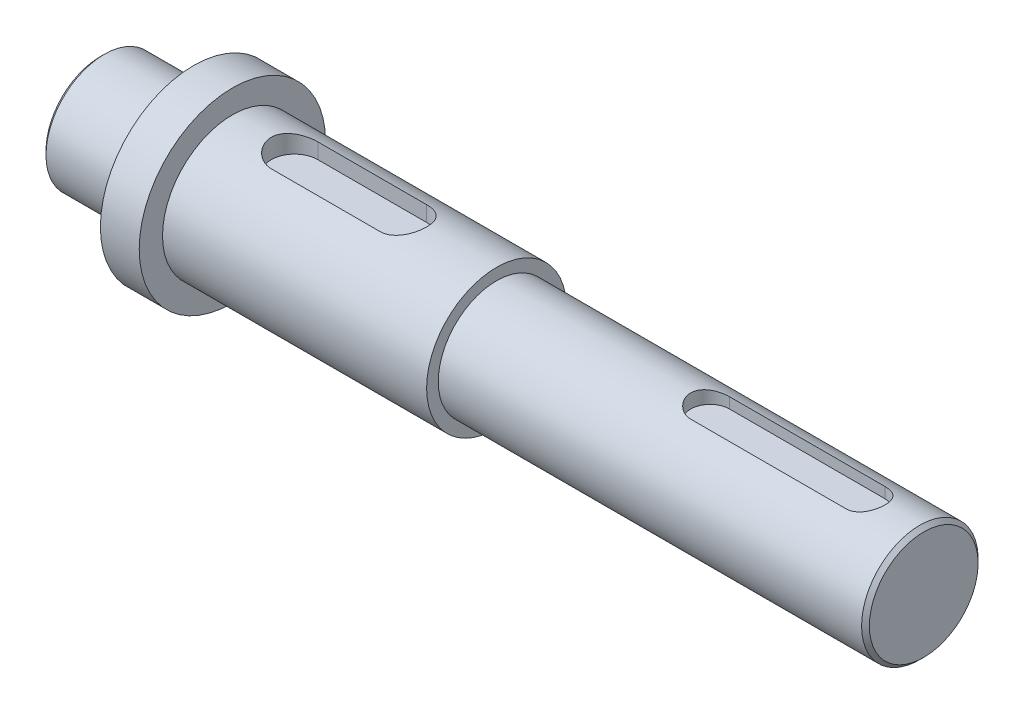
ISO-10303-21;
HEADER;
FILE_DESCRIPTION(('STEP AP214'),'2;1');
FILE_NAME('part.step','',(''),(''),'','','');
FILE_SCHEMA(('AUTOMOTIVE_DESIGN { 1 0 10303 214 1 1 1 1 }'));
ENDSEC;
DATA;
#1=APPLICATION_CONTEXT('core data for automotive mechanical design processes');
#2=APPLICATION_PROTOCOL_DEFINITION('international standard','automotive_design',2000,#1);
#3=PRODUCT_CONTEXT('',#1,'mechanical');
#4=PRODUCT('Part','Part','',(#3));
#5=PRODUCT_RELATED_PRODUCT_CATEGORY('part','',(#4));
#6=PRODUCT_DEFINITION_FORMATION('','',#4);
#7=PRODUCT_DEFINITION_CONTEXT('part definition',#1,'design');
#8=PRODUCT_DEFINITION('design','',#6,#7);
#9=PRODUCT_DEFINITION_SHAPE('','',#8);
#10=(LENGTH_UNIT() NAMED_UNIT(*) SI_UNIT(.MILLI.,.METRE.));
#11=(NAMED_UNIT(*) PLANE_ANGLE_UNIT() SI_UNIT($,.RADIAN.));
#12=(NAMED_UNIT(*) SI_UNIT($,.STERADIAN.) SOLID_ANGLE_UNIT());
#13=UNCERTAINTY_MEASURE_WITH_UNIT(LENGTH_MEASURE(1.E-05),#10,'distance_accuracy_value','');
#14=(GEOMETRIC_REPRESENTATION_CONTEXT(3) GLOBAL_UNCERTAINTY_ASSIGNED_CONTEXT((#13)) GLOBAL_UNIT_ASSIGNED_CONTEXT((#10,
#11,#12)) REPRESENTATION_CONTEXT('',''));
#15=CARTESIAN_POINT('',(0.,0.,0.));
#16=DIRECTION('',(0.,0.,1.));
#17=DIRECTION('',(1.,0.,0.));
#18=AXIS2_PLACEMENT_3D('',#15,#16,#17);
#19=CARTESIAN_POINT('',(-69.1916508538899,0.,0.));
#20=DIRECTION('',(1.,0.,0.));
#21=DIRECTION('',(0.,0.,-1.));
#22=AXIS2_PLACEMENT_3D('',#19,#20,#21);
#23=PLANE('',#22);
#24=CARTESIAN_POINT('',(-69.1916508538899,0.,0.));
#25=DIRECTION('',(1.,0.,0.));
#26=DIRECTION('',(0.,0.,-1.));
#27=AXIS2_PLACEMENT_3D('',#24,#25,#26);
#28=CIRCLE('',#27,7.00000000000001);
#29=CARTESIAN_POINT('',(-69.1916508538899,0.,-7.00000000000001));
#30=VERTEX_POINT('',#29);
#31=EDGE_CURVE('E51',#30,#30,#28,.F.);
#32=ORIENTED_EDGE('',*,*,#31,.T.);
#33=EDGE_LOOP('',(#32));
#34=FACE_BOUND('',#33,.T.);
#35=ADVANCED_FACE('F41',(#34),#23,.F.);
#36=CARTESIAN_POINT('',(-89.707779886148,0.,0.));
#37=DIRECTION('',(-1.,0.,0.));
#38=DIRECTION('',(0.,0.,1.));
#39=AXIS2_PLACEMENT_3D('',#36,#37,#38);
#40=CYLINDRICAL_SURFACE('',#39,7.5);
#41=CARTESIAN_POINT('',(-68.6916508538899,0.,0.));
#42=DIRECTION('',(1.,0.,0.));
#43=DIRECTION('',(0.,0.,-1.));
#44=AXIS2_PLACEMENT_3D('',#41,#42,#43);
#45=CIRCLE('',#44,7.5);
#46=CARTESIAN_POINT('',(-68.6916508538899,0.,-7.5));
#47=VERTEX_POINT('',#46);
#48=EDGE_CURVE('E11',#47,#47,#45,.T.);
#49=ORIENTED_EDGE('',*,*,#48,.T.);
#50=EDGE_LOOP('',(#49));
#51=FACE_BOUND('',#50,.T.);
#52=CARTESIAN_POINT('',(-57.1916508538899,0.,0.));
#53=DIRECTION('',(-1.,0.,0.));
#54=DIRECTION('',(0.,0.,1.));
#55=AXIS2_PLACEMENT_3D('',#52,#53,#54);
#56=CIRCLE('',#55,7.5);
#57=CARTESIAN_POINT('',(-57.1916508538899,0.,7.5));
#58=VERTEX_POINT('',#57);
#59=EDGE_CURVE('E198',#58,#58,#56,.T.);
#60=ORIENTED_EDGE('',*,*,#59,.T.);
#61=EDGE_LOOP('',(#60));
#62=FACE_BOUND('',#61,.T.);
#63=ADVANCED_FACE('F275',(#51,#62),#40,.T.);
#64=CARTESIAN_POINT('',(-57.1916508538899,7.5,0.));
#65=DIRECTION('',(1.,0.,0.));
#66=DIRECTION('',(0.,0.,-1.));
#67=AXIS2_PLACEMENT_3D('',#64,#65,#66);
#68=PLANE('',#67);
#69=ORIENTED_EDGE('',*,*,#59,.F.);
#70=EDGE_LOOP('',(#69));
#71=FACE_BOUND('',#70,.T.);
#72=CARTESIAN_POINT('',(-57.1916508538899,0.,0.));
#73=DIRECTION('',(-1.,0.,0.));
#74=DIRECTION('',(0.,0.,1.));
#75=AXIS2_PLACEMENT_3D('',#72,#73,#74);
#76=CIRCLE('',#75,12.);
#77=CARTESIAN_POINT('',(-57.1916508538899,0.,12.));
#78=VERTEX_POINT('',#77);
#79=EDGE_CURVE('E194',#78,#78,#76,.T.);
#80=ORIENTED_EDGE('',*,*,#79,.T.);
#81=EDGE_LOOP('',(#80));
#82=FACE_BOUND('',#81,.T.);
#83=ADVANCED_FACE('F281',(#71,#82),#68,.F.);
#84=CARTESIAN_POINT('',(-89.707779886148,0.,0.));
#85=DIRECTION('',(-1.,0.,0.));
#86=DIRECTION('',(0.,0.,1.));
#87=AXIS2_PLACEMENT_3D('',#84,#85,#86);
#88=CYLINDRICAL_SURFACE('',#87,12.);
#89=ORIENTED_EDGE('',*,*,#79,.F.);
#90=EDGE_LOOP('',(#89));
#91=FACE_BOUND('',#90,.T.);
#92=CARTESIAN_POINT('',(-52.1916508538899,0.,0.));
#93=DIRECTION('',(-1.,0.,0.));
#94=DIRECTION('',(0.,0.,1.));
#95=AXIS2_PLACEMENT_3D('',#92,#93,#94);
#96=CIRCLE('',#95,12.);
#97=CARTESIAN_POINT('',(-52.1916508538899,0.,12.));
#98=VERTEX_POINT('',#97);
#99=EDGE_CURVE('E190',#98,#98,#96,.T.);
#100=ORIENTED_EDGE('',*,*,#99,.T.);
#101=EDGE_LOOP('',(#100));
#102=FACE_BOUND('',#101,.T.);
#103=ADVANCED_FACE('F456',(#91,#102),#88,.T.);
#104=CARTESIAN_POINT('',(-52.1916508538899,12.,0.));
#105=DIRECTION('',(-1.,0.,0.));
#106=DIRECTION('',(0.,0.,1.));
#107=AXIS2_PLACEMENT_3D('',#104,#105,#106);
#108=PLANE('',#107);
#109=ORIENTED_EDGE('',*,*,#99,.F.);
#110=EDGE_LOOP('',(#109));
#111=FACE_BOUND('',#110,.T.);
#112=CARTESIAN_POINT('',(-52.1916508538899,0.,0.));
#113=DIRECTION('',(-1.,0.,0.));
#114=DIRECTION('',(0.,0.,1.));
#115=AXIS2_PLACEMENT_3D('',#112,#113,#114);
#116=CIRCLE('',#115,9.);
#117=CARTESIAN_POINT('',(-52.1916508538899,0.,9.));
#118=VERTEX_POINT('',#117);
#119=EDGE_CURVE('E186',#118,#118,#116,.T.);
#120=ORIENTED_EDGE('',*,*,#119,.T.);
#121=EDGE_LOOP('',(#120));
#122=FACE_BOUND('',#121,.T.);
#123=ADVANCED_FACE('F439',(#111,#122),#108,.F.);
#124=CARTESIAN_POINT('',(-89.707779886148,0.,0.));
#125=DIRECTION('',(-1.,0.,0.));
#126=DIRECTION('',(0.,0.,1.));
#127=AXIS2_PLACEMENT_3D('',#124,#125,#126);
#128=CYLINDRICAL_SURFACE('',#127,9.);
#129=DIRECTION('',(-1.,0.,0.));
#130=VECTOR('',#129,1.);
#131=CARTESIAN_POINT('',(-89.707779886148,8.48528137423857,-3.));
#132=LINE('',#131,#130);
#133=CARTESIAN_POINT('',(-44.1916508538899,8.48528137423857,-3.));
#134=VERTEX_POINT('',#133);
#135=CARTESIAN_POINT('',(-30.1916508538899,8.48528137423857,-3.));
#136=VERTEX_POINT('',#135);
#137=EDGE_CURVE('E427',#134,#136,#132,.F.);
#138=ORIENTED_EDGE('',*,*,#137,.T.);
#139=CARTESIAN_POINT('',(-30.1916508538899,8.48528137423857,-3.));
#140=CARTESIAN_POINT('',(-30.1098023605056,8.48526831927789,-3.00001078932487));
#141=CARTESIAN_POINT('',(-30.0279611642795,8.48646532685483,-2.99665064665902));
#142=CARTESIAN_POINT('',(-29.8649136078708,8.49118228945209,-2.98327254936565));
#143=CARTESIAN_POINT('',(-29.7837070823043,8.49470161740771,-2.97325639196642));
#144=CARTESIAN_POINT('',(-29.6227422678645,8.50395246303008,-2.94668951307354));
#145=CARTESIAN_POINT('',(-29.5429804108289,8.50967741820142,-2.93015817315762));
#146=CARTESIAN_POINT('',(-29.3852409315905,8.52315143887203,-2.89073017236145));
#147=CARTESIAN_POINT('',(-29.3072633739819,8.53090057752397,-2.86783328143241));
#148=CARTESIAN_POINT('',(-29.0768969582327,8.55683928952694,-2.7898986156743));
#149=CARTESIAN_POINT('',(-28.9278358649273,8.57773492660859,-2.72557700172276));
#150=CARTESIAN_POINT('',(-28.6425986801326,8.62436440905027,-2.5742134092753));
#151=CARTESIAN_POINT('',(-28.5064305709487,8.65010122261302,-2.4871574792233));
#152=CARTESIAN_POINT('',(-28.2454993697301,8.70463418867365,-2.28915595016086));
#153=CARTESIAN_POINT('',(-28.1213086825877,8.73350627313643,-2.17747541556634));
#154=CARTESIAN_POINT('',(-27.8930303299899,8.79041552071283,-1.93496485428979));
#155=CARTESIAN_POINT('',(-27.7889462442339,8.81845253440363,-1.80413142497752));
#156=CARTESIAN_POINT('',(-27.6012129848502,8.87141647315468,-1.52281106991368));
#157=CARTESIAN_POINT('',(-27.5181680848832,8.8962431223892,-1.37190030336069));
#158=CARTESIAN_POINT('',(-27.3788739146845,8.9390882626048,-1.05728771462316));
#159=CARTESIAN_POINT('',(-27.3226164589191,8.95710883299482,-0.893589817668321));
#160=CARTESIAN_POINT('',(-27.2404437234032,8.98377213313373,-0.564088045229086));
#161=CARTESIAN_POINT('',(-27.2135410524982,8.99271926928151,-0.398555505085339));
#162=CARTESIAN_POINT('',(-27.1877019420477,9.0013082524901,-0.0650969066624202));
#163=CARTESIAN_POINT('',(-27.1887588387912,9.00095231678788,0.102828571762972));
#164=CARTESIAN_POINT('',(-27.2181837198212,8.99118115872284,0.429311537733987));
#165=CARTESIAN_POINT('',(-27.245478817896,8.98212182877037,0.587978116884621));
#166=CARTESIAN_POINT('',(-27.3248303997818,8.9564088159923,0.898332184121461));
#167=CARTESIAN_POINT('',(-27.3768882565945,8.93975471206725,1.05001928471038));
#168=CARTESIAN_POINT('',(-27.5049151490252,8.90027004455731,1.34445790368094));
#169=CARTESIAN_POINT('',(-27.5811896880341,8.8773611217211,1.48706564697704));
#170=CARTESIAN_POINT('',(-27.7552300090946,8.82775164383326,1.75777363724201));
#171=CARTESIAN_POINT('',(-27.853001637214,8.80105005807909,1.88586992347828));
#172=CARTESIAN_POINT('',(-28.0726667363483,8.74518810577395,2.13029252762403));
#173=CARTESIAN_POINT('',(-28.1954779052143,8.71597116015319,2.24578277403273));
#174=CARTESIAN_POINT('',(-28.4589648991824,8.65942491449435,2.45481413464109));
#175=CARTESIAN_POINT('',(-28.5996464731824,8.63209622629495,2.5483481578384));
#176=CARTESIAN_POINT('',(-28.8977309321264,8.58210018141277,2.71201733554396));
#177=CARTESIAN_POINT('',(-29.0553500050085,8.55950759277136,2.78178668333576));
#178=CARTESIAN_POINT('',(-29.2993349884447,8.5316849132946,2.86551808116445));
#179=CARTESIAN_POINT('',(-29.3819076109602,8.52342263559069,2.889939000529));
#180=CARTESIAN_POINT('',(-29.5490212501003,8.50917513666655,2.93162549079289));
#181=CARTESIAN_POINT('',(-29.633561349226,8.50318887578236,2.94889432902107));
#182=CARTESIAN_POINT('',(-29.7968841316406,8.49410161473166,2.97496555991272));
#183=CARTESIAN_POINT('',(-29.875563714526,8.49080270505212,2.98435073218189));
#184=CARTESIAN_POINT('',(-30.0333763833948,8.48638843638536,2.99686829404165));
#185=CARTESIAN_POINT('',(-30.1125087515318,8.48527025982562,3.00000875209309));
#186=CARTESIAN_POINT('',(-30.1916508538899,8.48528137423857,3.));
#187=B_SPLINE_CURVE_WITH_KNOTS('',3,(#139,#140,#141,#142,#143,#144,#145,#146,#147,#148,#149,
#150,#151,#152,#153,#154,#155,#156,#157,#158,#159,#160,#161,#162,#163,#164,#165,#166,#167,#168,
#169,#170,#171,#172,#173,#174,#175,#176,#177,#178,#179,#180,#181,#182,#183,#184,#185,#186),
.UNSPECIFIED.,.F.,.F.,(4,2,2,2,2,2,2,2,2,2,2,2,2,2,2,2,2,2,2,2,2,2,2,4),(0.,0.245455454206297,
0.490844658508385,0.735509315314893,0.980182815366468,1.46881220307906,1.95774215958628,
2.46393436906068,2.97021661609277,3.48971320817338,4.00905095381417,4.51032334200243,
5.01147626109962,5.4929717741524,5.97449398742778,6.46234978495938,6.9503384178434,
7.46126084192185,7.97234804765762,8.49098011802155,8.75020549988895,9.00931232726958,
9.24695816264695,9.4842967485361),.UNSPECIFIED.);
#188=CARTESIAN_POINT('',(-30.1916508538899,8.48528137423857,3.));
#189=VERTEX_POINT('',#188);
#190=EDGE_CURVE('E202',#136,#189,#187,.T.);
#191=ORIENTED_EDGE('',*,*,#190,.T.);
#192=DIRECTION('',(-1.,0.,0.));
#193=VECTOR('',#192,1.);
#194=CARTESIAN_POINT('',(-89.707779886148,8.48528137423857,3.));
#195=LINE('',#194,#193);
#196=CARTESIAN_POINT('',(-44.1916508538899,8.48528137423857,3.));
#197=VERTEX_POINT('',#196);
#198=EDGE_CURVE('E434',#189,#197,#195,.T.);
#199=ORIENTED_EDGE('',*,*,#198,.T.);
#200=CARTESIAN_POINT('',(-44.1916508538899,8.48528137423857,3.));
#201=CARTESIAN_POINT('',(-44.2734993472743,8.48526831927789,3.00001078932487));
#202=CARTESIAN_POINT('',(-44.3553405435004,8.48646532685483,2.99665064665902));
#203=CARTESIAN_POINT('',(-44.5183880999091,8.49118228945209,2.98327254936565));
#204=CARTESIAN_POINT('',(-44.5995946254756,8.49470161740771,2.97325639196642));
#205=CARTESIAN_POINT('',(-44.7605594399154,8.50395246303008,2.94668951307354));
#206=CARTESIAN_POINT('',(-44.840321296951,8.50967741820142,2.93015817315762));
#207=CARTESIAN_POINT('',(-44.9980607761893,8.52315143887203,2.89073017236145));
#208=CARTESIAN_POINT('',(-45.0760383337979,8.53090057752397,2.86783328143241));
#209=CARTESIAN_POINT('',(-45.3064047495472,8.55683928952693,2.7898986156743));
#210=CARTESIAN_POINT('',(-45.4554658428526,8.57773492660859,2.72557700172276));
#211=CARTESIAN_POINT('',(-45.7407030276473,8.62436440905027,2.5742134092753));
#212=CARTESIAN_POINT('',(-45.8768711368311,8.65010122261301,2.4871574792233));
#213=CARTESIAN_POINT('',(-46.1378023380497,8.70463418867364,2.28915595016086));
#214=CARTESIAN_POINT('',(-46.2619930251922,8.73350627313643,2.17747541556635));
#215=CARTESIAN_POINT('',(-46.49027137779,8.79041552071283,1.93496485428979));
#216=CARTESIAN_POINT('',(-46.594355463546,8.81845253440363,1.80413142497752));
#217=CARTESIAN_POINT('',(-46.7820887229297,8.87141647315469,1.52281106991367));
#218=CARTESIAN_POINT('',(-46.8651336228967,8.8962431223892,1.37190030336069));
#219=CARTESIAN_POINT('',(-47.0044277930954,8.9390882626048,1.05728771462316));
#220=CARTESIAN_POINT('',(-47.0606852488608,8.95710883299482,0.89358981766832));
#221=CARTESIAN_POINT('',(-47.1428579843767,8.98377213313373,0.564088045229086));
#222=CARTESIAN_POINT('',(-47.1697606552816,8.99271926928151,0.398555505085339));
#223=CARTESIAN_POINT('',(-47.1955997657322,9.0013082524901,0.0650969066624194));
#224=CARTESIAN_POINT('',(-47.1945428689887,9.00095231678789,-0.102828571762973));
#225=CARTESIAN_POINT('',(-47.1651179879587,8.99118115872284,-0.429311537733988));
#226=CARTESIAN_POINT('',(-47.1378228898839,8.98212182877037,-0.58797811688462));
#227=CARTESIAN_POINT('',(-47.058471307998,8.9564088159923,-0.898332184121461));
#228=CARTESIAN_POINT('',(-47.0064134511854,8.93975471206725,-1.05001928471038));
#229=CARTESIAN_POINT('',(-46.8783865587547,8.90027004455731,-1.34445790368094));
#230=CARTESIAN_POINT('',(-46.8021120197458,8.87736112172109,-1.48706564697704));
#231=CARTESIAN_POINT('',(-46.6280716986852,8.82775164383326,-1.75777363724201));
#232=CARTESIAN_POINT('',(-46.5303000705659,8.80105005807909,-1.88586992347829));
#233=CARTESIAN_POINT('',(-46.3106349714316,8.74518810577395,-2.13029252762403));
#234=CARTESIAN_POINT('',(-46.1878238025656,8.71597116015319,-2.24578277403273));
#235=CARTESIAN_POINT('',(-45.9243368085975,8.65942491449435,-2.45481413464109));
#236=CARTESIAN_POINT('',(-45.7836552345975,8.63209622629495,-2.54834815783839));
#237=CARTESIAN_POINT('',(-45.4855707756535,8.58210018141277,-2.71201733554396));
#238=CARTESIAN_POINT('',(-45.3279517027713,8.55950759277136,-2.78178668333576));
#239=CARTESIAN_POINT('',(-45.0839667193352,8.5316849132946,-2.86551808116445));
#240=CARTESIAN_POINT('',(-45.0013940968197,8.52342263559069,-2.889939000529));
#241=CARTESIAN_POINT('',(-44.8342804576796,8.50917513666655,-2.93162549079289));
#242=CARTESIAN_POINT('',(-44.7497403585539,8.50318887578236,-2.94889432902107));
#243=CARTESIAN_POINT('',(-44.5864175761393,8.49410161473166,-2.97496555991272));
#244=CARTESIAN_POINT('',(-44.5077379932539,8.49080270505212,-2.98435073218189));
#245=CARTESIAN_POINT('',(-44.3499253243851,8.48638843638536,-2.99686829404165));
#246=CARTESIAN_POINT('',(-44.2707929562481,8.48527025982562,-3.00000875209309));
#247=CARTESIAN_POINT('',(-44.19165085389,8.48528137423857,-3.));
#248=B_SPLINE_CURVE_WITH_KNOTS('',3,(#200,#201,#202,#203,#204,#205,#206,#207,#208,#209,#210,
#211,#212,#213,#214,#215,#216,#217,#218,#219,#220,#221,#222,#223,#224,#225,#226,#227,#228,#229,
#230,#231,#232,#233,#234,#235,#236,#237,#238,#239,#240,#241,#242,#243,#244,#245,#246,#247),
.UNSPECIFIED.,.F.,.F.,(4,2,2,2,2,2,2,2,2,2,2,2,2,2,2,2,2,2,2,2,2,2,2,4),(0.,0.245455454206294,
0.490844658508392,0.735509315314893,0.980182815366468,1.46881220307906,1.95774215958628,
2.46393436906068,2.97021661609277,3.48971320817339,4.00905095381416,4.51032334200243,
5.01147626109962,5.4929717741524,5.97449398742778,6.46234978495938,6.9503384178434,
7.46126084192185,7.97234804765761,8.49098011802155,8.75020549988896,9.00931232726959,
9.24695816264695,9.48429674853609),.UNSPECIFIED.);
#249=EDGE_CURVE('E66',#197,#134,#248,.T.);
#250=ORIENTED_EDGE('',*,*,#249,.T.);
#251=EDGE_LOOP('',(#138,#191,#199,#250));
#252=FACE_BOUND('',#251,.T.);
#253=ORIENTED_EDGE('',*,*,#119,.F.);
#254=EDGE_LOOP('',(#253));
#255=FACE_BOUND('',#254,.T.);
#256=CARTESIAN_POINT('',(-18.1916508538899,0.,0.));
#257=DIRECTION('',(-1.,0.,0.));
#258=DIRECTION('',(0.,0.,1.));
#259=AXIS2_PLACEMENT_3D('',#256,#257,#258);
#260=CIRCLE('',#259,9.);
#261=CARTESIAN_POINT('',(-18.1916508538899,0.,9.));
#262=VERTEX_POINT('',#261);
#263=EDGE_CURVE('E182',#262,#262,#260,.T.);
#264=ORIENTED_EDGE('',*,*,#263,.T.);
#265=EDGE_LOOP('',(#264));
#266=FACE_BOUND('',#265,.T.);
#267=ADVANCED_FACE('F218',(#252,#255,#266),#128,.T.);
#268=CARTESIAN_POINT('',(-18.1916508538899,9.,0.));
#269=DIRECTION('',(-1.,0.,0.));
#270=DIRECTION('',(0.,0.,1.));
#271=AXIS2_PLACEMENT_3D('',#268,#269,#270);
#272=PLANE('',#271);
#273=ORIENTED_EDGE('',*,*,#263,.F.);
#274=EDGE_LOOP('',(#273));
#275=FACE_BOUND('',#274,.T.);
#276=CARTESIAN_POINT('',(-18.1916508538899,0.,0.));
#277=DIRECTION('',(-1.,0.,0.));
#278=DIRECTION('',(0.,0.,1.));
#279=AXIS2_PLACEMENT_3D('',#276,#277,#278);
#280=CIRCLE('',#279,7.5);
#281=CARTESIAN_POINT('',(-18.1916508538899,0.,7.5));
#282=VERTEX_POINT('',#281);
#283=EDGE_CURVE('E168',#282,#282,#280,.T.);
#284=ORIENTED_EDGE('',*,*,#283,.T.);
#285=EDGE_LOOP('',(#284));
#286=FACE_BOUND('',#285,.T.);
#287=ADVANCED_FACE('F245',(#275,#286),#272,.F.);
#288=CARTESIAN_POINT('',(-89.707779886148,0.,0.));
#289=DIRECTION('',(-1.,0.,0.));
#290=DIRECTION('',(0.,0.,1.));
#291=AXIS2_PLACEMENT_3D('',#288,#289,#290);
#292=CYLINDRICAL_SURFACE('',#291,7.5);
#293=CARTESIAN_POINT('',(36.3083491461101,0.,0.));
#294=DIRECTION('',(-1.,0.,0.));
#295=DIRECTION('',(0.,0.,1.));
#296=AXIS2_PLACEMENT_3D('',#293,#294,#295);
#297=CIRCLE('',#296,7.5);
#298=CARTESIAN_POINT('',(36.3083491461101,0.,7.5));
#299=VERTEX_POINT('',#298);
#300=EDGE_CURVE('E304',#299,#299,#297,.T.);
#301=ORIENTED_EDGE('',*,*,#300,.T.);
#302=EDGE_LOOP('',(#301));
#303=FACE_BOUND('',#302,.T.);
#304=DIRECTION('',(-1.,0.,0.));
#305=VECTOR('',#304,1.);
#306=CARTESIAN_POINT('',(-89.707779886148,7.07106781186548,-2.5));
#307=LINE('',#306,#305);
#308=CARTESIAN_POINT('',(9.30834914611006,7.07106781186548,-2.5));
#309=VERTEX_POINT('',#308);
#310=CARTESIAN_POINT('',(29.3083491461101,7.07106781186548,-2.5));
#311=VERTEX_POINT('',#310);
#312=EDGE_CURVE('E306',#309,#311,#307,.F.);
#313=ORIENTED_EDGE('',*,*,#312,.T.);
#314=CARTESIAN_POINT('',(29.3083491461101,7.07106781186548,-2.5));
#315=CARTESIAN_POINT('',(29.3765562239304,7.07105693273157,-2.50000899110406));
#316=CARTESIAN_POINT('',(29.4447572207855,7.07205443904569,-2.49720887221585));
#317=CARTESIAN_POINT('',(29.5806301844593,7.07598524121007,-2.4860604578047));
#318=CARTESIAN_POINT('',(29.6483022890981,7.07891801450643,-2.47771365997202));
#319=CARTESIAN_POINT('',(29.7824396344646,7.08662705252507,-2.45557459422795));
#320=CARTESIAN_POINT('',(29.8489078486609,7.09139784850118,-2.44179847763135));
#321=CARTESIAN_POINT('',(29.9803574146929,7.10262619906002,-2.4089418103012));
#322=CARTESIAN_POINT('',(30.0453387127,7.10908381460331,-2.38986106786032));
#323=CARTESIAN_POINT('',(30.2373107258247,7.13069940793912,-2.32491551306196));
#324=CARTESIAN_POINT('',(30.36152830358,7.14811243884051,-2.2713141681025));
#325=CARTESIAN_POINT('',(30.5992259575734,7.1869703408752,-2.14517784106255));
#326=CARTESIAN_POINT('',(30.7126993818902,7.20841768551077,-2.07263123268532));
#327=CARTESIAN_POINT('',(30.9301420495809,7.25386182389479,-1.90762995846819));
#328=CARTESIAN_POINT('',(31.0336342888783,7.27792189428067,-1.81456284630833));
#329=CARTESIAN_POINT('',(31.2238662493438,7.32534626726038,-1.61247071190512));
#330=CARTESIAN_POINT('',(31.3106029874291,7.34871044533518,-1.50344285413658));
#331=CARTESIAN_POINT('',(31.4670473703725,7.39284706096344,-1.26900922493972));
#332=CARTESIAN_POINT('',(31.5362514538523,7.41353593532888,-1.1432502528446));
#333=CARTESIAN_POINT('',(31.6523299285448,7.44924021883279,-0.881073095475285));
#334=CARTESIAN_POINT('',(31.6992111410358,7.46425736081204,-0.74465818122588));
#335=CARTESIAN_POINT('',(31.7676884223683,7.48647677762783,-0.470073371182905));
#336=CARTESIAN_POINT('',(31.7901073170673,7.49393272446142,-0.33212958815374));
#337=CARTESIAN_POINT('',(31.8116399028486,7.50109021034827,-0.0542474216361978));
#338=CARTESIAN_POINT('',(31.8107591470258,7.50079359709905,0.0856904786402175));
#339=CARTESIAN_POINT('',(31.7862384357096,7.49265096581776,0.357759612692404));
#340=CARTESIAN_POINT('',(31.7634925505053,7.48510152476447,0.489981756428174));
#341=CARTESIAN_POINT('',(31.6973661501309,7.46367401253772,0.748610161077312));
#342=CARTESIAN_POINT('',(31.6539844907848,7.44979559044789,0.875016099077737));
#343=CARTESIAN_POINT('',(31.5472957219156,7.41689170677793,1.12038155754035));
#344=CARTESIAN_POINT('',(31.4837340332524,7.39780094595656,1.23922126412503));
#345=CARTESIAN_POINT('',(31.3386992676851,7.35645969200236,1.46481147275367));
#346=CARTESIAN_POINT('',(31.2572213185079,7.33420833994017,1.57155867428943));
#347=CARTESIAN_POINT('',(31.0741715211031,7.28765679856813,1.77524334927518));
#348=CARTESIAN_POINT('',(30.9718352870818,7.26330946699776,1.87148402903098));
#349=CARTESIAN_POINT('',(30.7522454218236,7.21618726182138,2.04568006205172));
#350=CARTESIAN_POINT('',(30.634986990103,7.19341289789386,2.12362950795974));
#351=CARTESIAN_POINT('',(30.3866487002258,7.15175078440791,2.26000831398175));
#352=CARTESIAN_POINT('',(30.2553903587774,7.13292537370586,2.31813252376915));
#353=CARTESIAN_POINT('',(29.9842317021355,7.10202742655098,2.41115057675285));
#354=CARTESIAN_POINT('',(29.8443454126797,7.08994423522482,2.4460810901384));
#355=CARTESIAN_POINT('',(29.6373025542401,7.078413552368,2.47914539070207));
#356=CARTESIAN_POINT('',(29.5717456714745,7.07566669236505,2.48696265313779));
#357=CARTESIAN_POINT('',(29.4402539501105,7.07199258928497,2.497386540178));
#358=CARTESIAN_POINT('',(29.3743197097491,7.0710629982382,2.49999988848745));
#359=CARTESIAN_POINT('',(29.3083491461101,7.07106781186548,2.5));
#360=B_SPLINE_CURVE_WITH_KNOTS('',3,(#314,#315,#316,#317,#318,#319,#320,#321,#322,#323,#324,
#325,#326,#327,#328,#329,#330,#331,#332,#333,#334,#335,#336,#337,#338,#339,#340,#341,#342,#343,
#344,#345,#346,#347,#348,#349,#350,#351,#352,#353,#354,#355,#356,#357,#358,#359),.UNSPECIFIED.,
.F.,.F.,(4,2,2,2,2,2,2,2,2,2,2,2,2,2,2,2,2,2,2,2,2,2,4),(0.,0.204546211838584,0.409037215423656,
0.612924429429078,0.816819012805388,1.22401016923255,1.63145179965523,2.05327864088389,
2.47518051341064,2.90809434014449,3.34087579484514,3.75860278500203,4.17623021758301,
4.57747647846033,4.97874498952315,5.38529148746615,5.79194868153616,6.21771736826821,
6.64362337304801,7.07581676501795,7.50732520398793,7.70536340013574,7.90314555504337),.UNSPECIFIED.);
#361=CARTESIAN_POINT('',(29.3083491461101,7.07106781186548,2.5));
#362=VERTEX_POINT('',#361);
#363=EDGE_CURVE('E249',#311,#362,#360,.T.);
#364=ORIENTED_EDGE('',*,*,#363,.T.);
#365=DIRECTION('',(-1.,0.,0.));
#366=VECTOR('',#365,1.);
#367=CARTESIAN_POINT('',(-89.707779886148,7.07106781186548,2.5));
#368=LINE('',#367,#366);
#369=CARTESIAN_POINT('',(9.30834914611006,7.07106781186548,2.5));
#370=VERTEX_POINT('',#369);
#371=EDGE_CURVE('E264',#362,#370,#368,.T.);
#372=ORIENTED_EDGE('',*,*,#371,.T.);
#373=CARTESIAN_POINT('',(9.30834914611006,7.07106781186548,2.5));
#374=CARTESIAN_POINT('',(9.24014206828974,7.07105693273157,2.50000899110406));
#375=CARTESIAN_POINT('',(9.17194107143467,7.07205443904569,2.49720887221585));
#376=CARTESIAN_POINT('',(9.0360681077608,7.07598524121007,2.4860604578047));
#377=CARTESIAN_POINT('',(8.96839600312201,7.07891801450643,2.47771365997202));
#378=CARTESIAN_POINT('',(8.83425865775551,7.08662705252507,2.45557459422795));
#379=CARTESIAN_POINT('',(8.76779044355919,7.09139784850118,2.44179847763135));
#380=CARTESIAN_POINT('',(8.63634087752725,7.10262619906002,2.4089418103012));
#381=CARTESIAN_POINT('',(8.57135957952016,7.10908381460331,2.38986106786032));
#382=CARTESIAN_POINT('',(8.37938756639545,7.13069940793912,2.32491551306196));
#383=CARTESIAN_POINT('',(8.25516998864008,7.14811243884052,2.2713141681025));
#384=CARTESIAN_POINT('',(8.01747233464667,7.1869703408752,2.14517784106254));
#385=CARTESIAN_POINT('',(7.90399891032987,7.20841768551077,2.07263123268531));
#386=CARTESIAN_POINT('',(7.68655624263926,7.25386182389479,1.90762995846818));
#387=CARTESIAN_POINT('',(7.58306400334186,7.27792189428067,1.81456284630833));
#388=CARTESIAN_POINT('',(7.39283204287636,7.32534626726038,1.61247071190512));
#389=CARTESIAN_POINT('',(7.30609530479106,7.34871044533518,1.50344285413658));
#390=CARTESIAN_POINT('',(7.1496509218476,7.39284706096344,1.26900922493972));
#391=CARTESIAN_POINT('',(7.08044683836782,7.41353593532888,1.14325025284461));
#392=CARTESIAN_POINT('',(6.96436836367536,7.44924021883279,0.881073095475287));
#393=CARTESIAN_POINT('',(6.91748715118435,7.46425736081204,0.744658181225881));
#394=CARTESIAN_POINT('',(6.8490098698518,7.48647677762783,0.470073371182906));
#395=CARTESIAN_POINT('',(6.82659097515283,7.49393272446142,0.332129588153741));
#396=CARTESIAN_POINT('',(6.80505838937154,7.50109021034827,0.0542474216361973));
#397=CARTESIAN_POINT('',(6.8059391451943,7.50079359709905,-0.0856904786402186));
#398=CARTESIAN_POINT('',(6.83045985651055,7.49265096581776,-0.357759612692406));
#399=CARTESIAN_POINT('',(6.85320574171479,7.48510152476446,-0.489981756428176));
#400=CARTESIAN_POINT('',(6.91933214208925,7.46367401253772,-0.748610161077315));
#401=CARTESIAN_POINT('',(6.96271380143532,7.44979559044789,-0.87501609907774));
#402=CARTESIAN_POINT('',(7.06940257030451,7.41689170677793,-1.12038155754035));
#403=CARTESIAN_POINT('',(7.13296425896768,7.39780094595656,-1.23922126412503));
#404=CARTESIAN_POINT('',(7.27799902453503,7.35645969200236,-1.46481147275367));
#405=CARTESIAN_POINT('',(7.35947697371218,7.33420833994017,-1.57155867428944));
#406=CARTESIAN_POINT('',(7.54252677111701,7.28765679856813,-1.77524334927518));
#407=CARTESIAN_POINT('',(7.6448630051383,7.26330946699776,-1.87148402903098));
#408=CARTESIAN_POINT('',(7.86445287039649,7.21618726182137,-2.04568006205172));
#409=CARTESIAN_POINT('',(7.98171130211709,7.19341289789385,-2.12362950795974));
#410=CARTESIAN_POINT('',(8.23004959199435,7.15175078440791,-2.26000831398175));
#411=CARTESIAN_POINT('',(8.3613079334427,7.13292537370585,-2.31813252376915));
#412=CARTESIAN_POINT('',(8.63246659008466,7.10202742655098,-2.41115057675285));
#413=CARTESIAN_POINT('',(8.77235287954038,7.08994423522482,-2.4460810901384));
#414=CARTESIAN_POINT('',(8.97939573798004,7.078413552368,-2.47914539070207));
#415=CARTESIAN_POINT('',(9.04495262074564,7.07566669236505,-2.48696265313779));
#416=CARTESIAN_POINT('',(9.17644434210958,7.07199258928497,-2.497386540178));
#417=CARTESIAN_POINT('',(9.24237858247104,7.0710629982382,-2.49999988848745));
#418=CARTESIAN_POINT('',(9.30834914611006,7.07106781186548,-2.5));
#419=B_SPLINE_CURVE_WITH_KNOTS('',3,(#373,#374,#375,#376,#377,#378,#379,#380,#381,#382,#383,
#384,#385,#386,#387,#388,#389,#390,#391,#392,#393,#394,#395,#396,#397,#398,#399,#400,#401,#402,
#403,#404,#405,#406,#407,#408,#409,#410,#411,#412,#413,#414,#415,#416,#417,#418),.UNSPECIFIED.,
.F.,.F.,(4,2,2,2,2,2,2,2,2,2,2,2,2,2,2,2,2,2,2,2,2,2,4),(0.,0.20454621183858,0.409037215423654,
0.612924429429076,0.816819012805389,1.22401016923255,1.63145179965523,2.0532786408839,
2.47518051341064,2.90809434014449,3.34087579484514,3.75860278500203,4.17623021758302,
4.57747647846034,4.97874498952315,5.38529148746615,5.79194868153617,6.21771736826821,
6.64362337304802,7.07581676501796,7.50732520398793,7.70536340013574,7.90314555504337),.UNSPECIFIED.);
#420=EDGE_CURVE('E58',#370,#309,#419,.T.);
#421=ORIENTED_EDGE('',*,*,#420,.T.);
#422=EDGE_LOOP('',(#313,#364,#372,#421));
#423=FACE_BOUND('',#422,.T.);
#424=ORIENTED_EDGE('',*,*,#283,.F.);
#425=EDGE_LOOP('',(#424));
#426=FACE_BOUND('',#425,.T.);
#427=ADVANCED_FACE('F241',(#303,#423,#426),#292,.T.);
#428=CARTESIAN_POINT('',(36.8083491461101,7.5,0.));
#429=DIRECTION('',(-1.,0.,0.));
#430=DIRECTION('',(0.,0.,1.));
#431=AXIS2_PLACEMENT_3D('',#428,#429,#430);
#432=PLANE('',#431);
#433=CARTESIAN_POINT('',(36.8083491461101,0.,0.));
#434=DIRECTION('',(-1.,0.,0.));
#435=DIRECTION('',(0.,0.,1.));
#436=AXIS2_PLACEMENT_3D('',#433,#434,#435);
#437=CIRCLE('',#436,6.99999999999999);
#438=CARTESIAN_POINT('',(36.8083491461101,0.,6.99999999999999));
#439=VERTEX_POINT('',#438);
#440=EDGE_CURVE('E301',#439,#439,#437,.F.);
#441=ORIENTED_EDGE('',*,*,#440,.T.);
#442=EDGE_LOOP('',(#441));
#443=FACE_BOUND('',#442,.T.);
#444=ADVANCED_FACE('F238',(#443),#432,.F.);
#445=CARTESIAN_POINT('',(-44.1916508538899,6.5,0.));
#446=DIRECTION('',(0.,1.,0.));
#447=DIRECTION('',(0.,0.,1.));
#448=AXIS2_PLACEMENT_3D('',#445,#446,#447);
#449=CYLINDRICAL_SURFACE('',#448,3.);
#450=DIRECTION('',(0.,1.,0.));
#451=VECTOR('',#450,1.);
#452=CARTESIAN_POINT('',(-44.1916508538899,6.5,3.));
#453=LINE('',#452,#451);
#454=CARTESIAN_POINT('',(-44.1916508538899,6.5,3.));
#455=VERTEX_POINT('',#454);
#456=EDGE_CURVE('E164',#455,#197,#453,.T.);
#457=ORIENTED_EDGE('',*,*,#456,.F.);
#458=CARTESIAN_POINT('',(-44.1916508538899,6.5,0.));
#459=DIRECTION('',(0.,1.,0.));
#460=DIRECTION('',(0.,0.,1.));
#461=AXIS2_PLACEMENT_3D('',#458,#459,#460);
#462=CIRCLE('',#461,3.);
#463=CARTESIAN_POINT('',(-44.1916508538899,6.5,-3.));
#464=VERTEX_POINT('',#463);
#465=EDGE_CURVE('E142',#464,#455,#462,.T.);
#466=ORIENTED_EDGE('',*,*,#465,.F.);
#467=DIRECTION('',(0.,1.,0.));
#468=VECTOR('',#467,1.);
#469=CARTESIAN_POINT('',(-44.1916508538899,6.5,-3.));
#470=LINE('',#469,#468);
#471=EDGE_CURVE('E165',#464,#134,#470,.T.);
#472=ORIENTED_EDGE('',*,*,#471,.T.);
#473=ORIENTED_EDGE('',*,*,#249,.F.);
#474=EDGE_LOOP('',(#457,#466,#472,#473));
#475=FACE_BOUND('',#474,.T.);
#476=ADVANCED_FACE('F234',(#475),#449,.F.);
#477=CARTESIAN_POINT('',(-44.1916508538899,6.5,-3.));
#478=DIRECTION('',(0.,0.,-1.));
#479=DIRECTION('',(-1.,0.,0.));
#480=AXIS2_PLACEMENT_3D('',#477,#478,#479);
#481=PLANE('',#480);
#482=ORIENTED_EDGE('',*,*,#471,.F.);
#483=DIRECTION('',(-1.,0.,0.));
#484=VECTOR('',#483,1.);
#485=CARTESIAN_POINT('',(-44.1916508538899,6.5,-3.));
#486=LINE('',#485,#484);
#487=CARTESIAN_POINT('',(-30.1916508538899,6.5,-3.));
#488=VERTEX_POINT('',#487);
#489=EDGE_CURVE('E160',#488,#464,#486,.T.);
#490=ORIENTED_EDGE('',*,*,#489,.F.);
#491=DIRECTION('',(0.,1.,0.));
#492=VECTOR('',#491,1.);
#493=CARTESIAN_POINT('',(-30.1916508538899,6.5,-3.));
#494=LINE('',#493,#492);
#495=EDGE_CURVE('E169',#488,#136,#494,.T.);
#496=ORIENTED_EDGE('',*,*,#495,.T.);
#497=ORIENTED_EDGE('',*,*,#137,.F.);
#498=EDGE_LOOP('',(#482,#490,#496,#497));
#499=FACE_BOUND('',#498,.T.);
#500=ADVANCED_FACE('F228',(#499),#481,.F.);
#501=CARTESIAN_POINT('',(-30.1916508538899,6.5,0.));
#502=DIRECTION('',(0.,1.,0.));
#503=DIRECTION('',(0.,0.,1.));
#504=AXIS2_PLACEMENT_3D('',#501,#502,#503);
#505=CYLINDRICAL_SURFACE('',#504,3.);
#506=ORIENTED_EDGE('',*,*,#495,.F.);
#507=CARTESIAN_POINT('',(-30.1916508538899,6.5,0.));
#508=DIRECTION('',(0.,1.,0.));
#509=DIRECTION('',(0.,0.,1.));
#510=AXIS2_PLACEMENT_3D('',#507,#508,#509);
#511=CIRCLE('',#510,3.);
#512=CARTESIAN_POINT('',(-30.1916508538899,6.5,3.));
#513=VERTEX_POINT('',#512);
#514=EDGE_CURVE('E156',#513,#488,#511,.T.);
#515=ORIENTED_EDGE('',*,*,#514,.F.);
#516=DIRECTION('',(0.,1.,0.));
#517=VECTOR('',#516,1.);
#518=CARTESIAN_POINT('',(-30.1916508538899,6.5,3.));
#519=LINE('',#518,#517);
#520=EDGE_CURVE('E173',#513,#189,#519,.T.);
#521=ORIENTED_EDGE('',*,*,#520,.T.);
#522=ORIENTED_EDGE('',*,*,#190,.F.);
#523=EDGE_LOOP('',(#506,#515,#521,#522));
#524=FACE_BOUND('',#523,.T.);
#525=ADVANCED_FACE('F222',(#524),#505,.F.);
#526=CARTESIAN_POINT('',(-44.1916508538899,6.5,3.));
#527=DIRECTION('',(0.,0.,1.));
#528=DIRECTION('',(1.,0.,0.));
#529=AXIS2_PLACEMENT_3D('',#526,#527,#528);
#530=PLANE('',#529);
#531=ORIENTED_EDGE('',*,*,#520,.F.);
#532=DIRECTION('',(1.,0.,0.));
#533=VECTOR('',#532,1.);
#534=CARTESIAN_POINT('',(-44.1916508538899,6.5,3.));
#535=LINE('',#534,#533);
#536=EDGE_CURVE('E152',#455,#513,#535,.T.);
#537=ORIENTED_EDGE('',*,*,#536,.F.);
#538=ORIENTED_EDGE('',*,*,#456,.T.);
#539=ORIENTED_EDGE('',*,*,#198,.F.);
#540=EDGE_LOOP('',(#531,#537,#538,#539));
#541=FACE_BOUND('',#540,.T.);
#542=ADVANCED_FACE('F227',(#541),#530,.F.);
#543=CARTESIAN_POINT('',(-44.1916508538899,6.5,0.));
#544=DIRECTION('',(0.,1.,0.));
#545=DIRECTION('',(0.,0.,1.));
#546=AXIS2_PLACEMENT_3D('',#543,#544,#545);
#547=PLANE('',#546);
#548=ORIENTED_EDGE('',*,*,#465,.T.);
#549=ORIENTED_EDGE('',*,*,#536,.T.);
#550=ORIENTED_EDGE('',*,*,#514,.T.);
#551=ORIENTED_EDGE('',*,*,#489,.T.);
#552=EDGE_LOOP('',(#548,#549,#550,#551));
#553=FACE_BOUND('',#552,.T.);
#554=ADVANCED_FACE('F232',(#553),#547,.T.);
#555=CARTESIAN_POINT('',(9.30834914611006,5.7,0.));
#556=DIRECTION('',(0.,1.,0.));
#557=DIRECTION('',(0.,0.,1.));
#558=AXIS2_PLACEMENT_3D('',#555,#556,#557);
#559=CYLINDRICAL_SURFACE('',#558,2.5);
#560=DIRECTION('',(0.,1.,0.));
#561=VECTOR('',#560,1.);
#562=CARTESIAN_POINT('',(9.30834914611006,5.7,2.5));
#563=LINE('',#562,#561);
#564=CARTESIAN_POINT('',(9.30834914611006,5.7,2.5));
#565=VERTEX_POINT('',#564);
#566=EDGE_CURVE('E108',#565,#370,#563,.T.);
#567=ORIENTED_EDGE('',*,*,#566,.F.);
#568=CARTESIAN_POINT('',(9.30834914611006,5.7,0.));
#569=DIRECTION('',(0.,1.,0.));
#570=DIRECTION('',(0.,0.,1.));
#571=AXIS2_PLACEMENT_3D('',#568,#569,#570);
#572=CIRCLE('',#571,2.5);
#573=CARTESIAN_POINT('',(9.30834914611006,5.7,-2.5));
#574=VERTEX_POINT('',#573);
#575=EDGE_CURVE('E112',#574,#565,#572,.T.);
#576=ORIENTED_EDGE('',*,*,#575,.F.);
#577=DIRECTION('',(0.,1.,0.));
#578=VECTOR('',#577,1.);
#579=CARTESIAN_POINT('',(9.30834914611006,5.7,-2.5));
#580=LINE('',#579,#578);
#581=EDGE_CURVE('E139',#574,#309,#580,.T.);
#582=ORIENTED_EDGE('',*,*,#581,.T.);
#583=ORIENTED_EDGE('',*,*,#420,.F.);
#584=EDGE_LOOP('',(#567,#576,#582,#583));
#585=FACE_BOUND('',#584,.T.);
#586=ADVANCED_FACE('F110',(#585),#559,.F.);
#587=CARTESIAN_POINT('',(9.30834914611006,5.7,-2.5));
#588=DIRECTION('',(0.,0.,-1.));
#589=DIRECTION('',(-1.,0.,0.));
#590=AXIS2_PLACEMENT_3D('',#587,#588,#589);
#591=PLANE('',#590);
#592=ORIENTED_EDGE('',*,*,#581,.F.);
#593=DIRECTION('',(-1.,0.,0.));
#594=VECTOR('',#593,1.);
#595=CARTESIAN_POINT('',(9.30834914611006,5.7,-2.5));
#596=LINE('',#595,#594);
#597=CARTESIAN_POINT('',(29.3083491461101,5.7,-2.5));
#598=VERTEX_POINT('',#597);
#599=EDGE_CURVE('E118',#598,#574,#596,.T.);
#600=ORIENTED_EDGE('',*,*,#599,.F.);
#601=DIRECTION('',(0.,1.,0.));
#602=VECTOR('',#601,1.);
#603=CARTESIAN_POINT('',(29.3083491461101,5.7,-2.5));
#604=LINE('',#603,#602);
#605=EDGE_CURVE('E143',#598,#311,#604,.T.);
#606=ORIENTED_EDGE('',*,*,#605,.T.);
#607=ORIENTED_EDGE('',*,*,#312,.F.);
#608=EDGE_LOOP('',(#592,#600,#606,#607));
#609=FACE_BOUND('',#608,.T.);
#610=ADVANCED_FACE('F269',(#609),#591,.F.);
#611=CARTESIAN_POINT('',(29.3083491461101,5.7,0.));
#612=DIRECTION('',(0.,1.,0.));
#613=DIRECTION('',(0.,0.,1.));
#614=AXIS2_PLACEMENT_3D('',#611,#612,#613);
#615=CYLINDRICAL_SURFACE('',#614,2.5);
#616=ORIENTED_EDGE('',*,*,#605,.F.);
#617=CARTESIAN_POINT('',(29.3083491461101,5.7,0.));
#618=DIRECTION('',(0.,1.,0.));
#619=DIRECTION('',(0.,0.,1.));
#620=AXIS2_PLACEMENT_3D('',#617,#618,#619);
#621=CIRCLE('',#620,2.5);
#622=CARTESIAN_POINT('',(29.3083491461101,5.7,2.5));
#623=VERTEX_POINT('',#622);
#624=EDGE_CURVE('E128',#623,#598,#621,.T.);
#625=ORIENTED_EDGE('',*,*,#624,.F.);
#626=DIRECTION('',(0.,1.,0.));
#627=VECTOR('',#626,1.);
#628=CARTESIAN_POINT('',(29.3083491461101,5.7,2.5));
#629=LINE('',#628,#627);
#630=EDGE_CURVE('E117',#623,#362,#629,.T.);
#631=ORIENTED_EDGE('',*,*,#630,.T.);
#632=ORIENTED_EDGE('',*,*,#363,.F.);
#633=EDGE_LOOP('',(#616,#625,#631,#632));
#634=FACE_BOUND('',#633,.T.);
#635=ADVANCED_FACE('F320',(#634),#615,.F.);
#636=CARTESIAN_POINT('',(9.30834914611006,5.7,2.5));
#637=DIRECTION('',(0.,0.,1.));
#638=DIRECTION('',(1.,0.,0.));
#639=AXIS2_PLACEMENT_3D('',#636,#637,#638);
#640=PLANE('',#639);
#641=ORIENTED_EDGE('',*,*,#630,.F.);
#642=DIRECTION('',(1.,0.,0.));
#643=VECTOR('',#642,1.);
#644=CARTESIAN_POINT('',(9.30834914611006,5.7,2.5));
#645=LINE('',#644,#643);
#646=EDGE_CURVE('E121',#565,#623,#645,.T.);
#647=ORIENTED_EDGE('',*,*,#646,.F.);
#648=ORIENTED_EDGE('',*,*,#566,.T.);
#649=ORIENTED_EDGE('',*,*,#371,.F.);
#650=EDGE_LOOP('',(#641,#647,#648,#649));
#651=FACE_BOUND('',#650,.T.);
#652=ADVANCED_FACE('F122',(#651),#640,.F.);
#653=CARTESIAN_POINT('',(9.30834914611006,5.7,0.));
#654=DIRECTION('',(0.,1.,0.));
#655=DIRECTION('',(0.,0.,1.));
#656=AXIS2_PLACEMENT_3D('',#653,#654,#655);
#657=PLANE('',#656);
#658=ORIENTED_EDGE('',*,*,#575,.T.);
#659=ORIENTED_EDGE('',*,*,#646,.T.);
#660=ORIENTED_EDGE('',*,*,#624,.T.);
#661=ORIENTED_EDGE('',*,*,#599,.T.);
#662=EDGE_LOOP('',(#658,#659,#660,#661));
#663=FACE_BOUND('',#662,.T.);
#664=ADVANCED_FACE('F130',(#663),#657,.T.);
#665=CARTESIAN_POINT('',(36.3083491461101,0.,0.));
#666=DIRECTION('',(-1.,0.,0.));
#667=DIRECTION('',(0.,0.,1.));
#668=AXIS2_PLACEMENT_3D('',#665,#666,#667);
#669=CONICAL_SURFACE('',#668,7.5,0.785398163397456);
#670=ORIENTED_EDGE('',*,*,#440,.F.);
#671=EDGE_LOOP('',(#670));
#672=FACE_BOUND('',#671,.T.);
#673=ORIENTED_EDGE('',*,*,#300,.F.);
#674=EDGE_LOOP('',(#673));
#675=FACE_BOUND('',#674,.T.);
#676=ADVANCED_FACE('F287',(#672,#675),#669,.T.);
#677=CARTESIAN_POINT('',(-69.1916508538899,0.,0.));
#678=DIRECTION('',(1.,0.,0.));
#679=DIRECTION('',(0.,0.,-1.));
#680=AXIS2_PLACEMENT_3D('',#677,#678,#679);
#681=CONICAL_SURFACE('',#680,7.00000000000001,0.785398163397442);
#682=ORIENTED_EDGE('',*,*,#48,.F.);
#683=EDGE_LOOP('',(#682));
#684=FACE_BOUND('',#683,.T.);
#685=ORIENTED_EDGE('',*,*,#31,.F.);
#686=EDGE_LOOP('',(#685));
#687=FACE_BOUND('',#686,.T.);
#688=ADVANCED_FACE('F44',(#684,#687),#681,.T.);
#689=CLOSED_SHELL('',(#35,#63,#83,#103,#123,#267,#287,#427,#444,#476,#500,#525,#542,#554,#586,
#610,#635,#652,#664,#676,#688));
#690=MANIFOLD_SOLID_BREP('B2',#689);
#691=ADVANCED_BREP_SHAPE_REPRESENTATION('',(#18,#690),#14);
#692=SHAPE_DEFINITION_REPRESENTATION(#9,#691);
ENDSEC;
END-ISO-10303-21;
